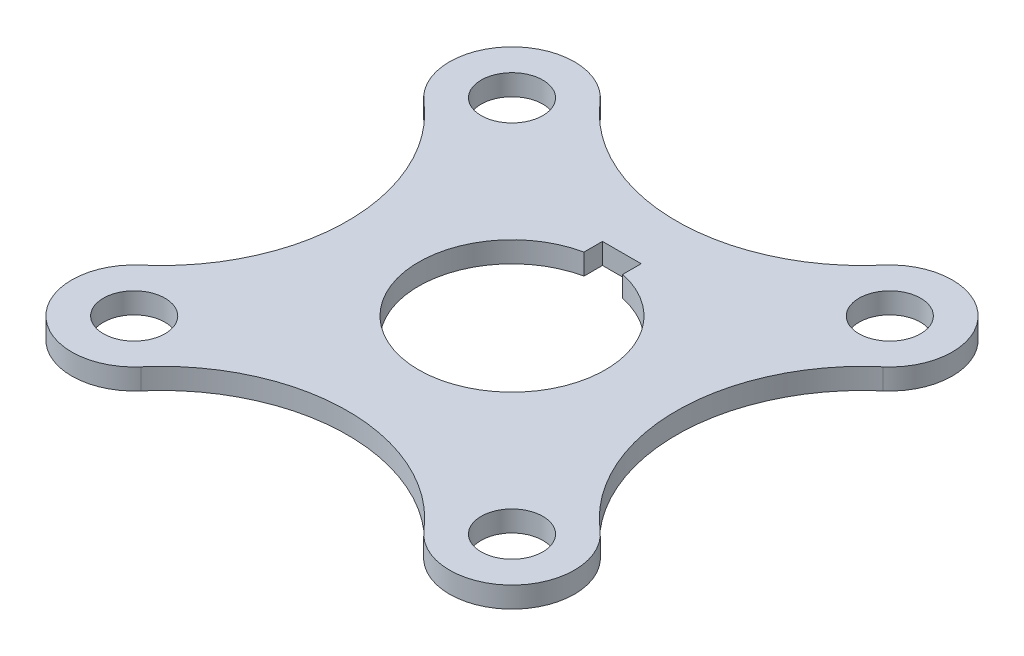
ISO-10303-21;
HEADER;
FILE_DESCRIPTION(('STEP AP214'),'2;1');
FILE_NAME('part.step','',(''),(''),'','','');
FILE_SCHEMA(('AUTOMOTIVE_DESIGN { 1 0 10303 214 1 1 1 1 }'));
ENDSEC;
DATA;
#1=APPLICATION_CONTEXT('core data for automotive mechanical design processes');
#2=APPLICATION_PROTOCOL_DEFINITION('international standard','automotive_design',2000,#1);
#3=PRODUCT_CONTEXT('',#1,'mechanical');
#4=PRODUCT('Part','Part','',(#3));
#5=PRODUCT_RELATED_PRODUCT_CATEGORY('part','',(#4));
#6=PRODUCT_DEFINITION_FORMATION('','',#4);
#7=PRODUCT_DEFINITION_CONTEXT('part definition',#1,'design');
#8=PRODUCT_DEFINITION('design','',#6,#7);
#9=PRODUCT_DEFINITION_SHAPE('','',#8);
#10=(LENGTH_UNIT() NAMED_UNIT(*) SI_UNIT(.MILLI.,.METRE.));
#11=(NAMED_UNIT(*) PLANE_ANGLE_UNIT() SI_UNIT($,.RADIAN.));
#12=(NAMED_UNIT(*) SI_UNIT($,.STERADIAN.) SOLID_ANGLE_UNIT());
#13=UNCERTAINTY_MEASURE_WITH_UNIT(LENGTH_MEASURE(1.E-05),#10,'distance_accuracy_value','');
#14=(GEOMETRIC_REPRESENTATION_CONTEXT(3) GLOBAL_UNCERTAINTY_ASSIGNED_CONTEXT((#13)) GLOBAL_UNIT_ASSIGNED_CONTEXT((#10,
#11,#12)) REPRESENTATION_CONTEXT('',''));
#15=CARTESIAN_POINT('',(0.,0.,0.));
#16=DIRECTION('',(0.,0.,1.));
#17=DIRECTION('',(1.,0.,0.));
#18=AXIS2_PLACEMENT_3D('',#15,#16,#17);
#19=CARTESIAN_POINT('',(-32.813907500035,2.54,-11.4904851942816));
#20=DIRECTION('',(0.,1.,0.));
#21=DIRECTION('',(0.,0.,1.));
#22=AXIS2_PLACEMENT_3D('',#19,#20,#21);
#23=PLANE('',#22);
#24=CARTESIAN_POINT('',(-22.980970388563,2.54,22.9809703885626));
#25=DIRECTION('',(0.,1.,0.));
#26=DIRECTION('',(0.,0.,1.));
#27=AXIS2_PLACEMENT_3D('',#24,#25,#26);
#28=CIRCLE('',#27,3.74999999999979);
#29=CARTESIAN_POINT('',(-22.980970388563,2.54,26.7309703885624));
#30=VERTEX_POINT('',#29);
#31=EDGE_CURVE('E383',#30,#30,#28,.T.);
#32=ORIENTED_EDGE('',*,*,#31,.F.);
#33=EDGE_LOOP('',(#32));
#34=FACE_BOUND('',#33,.T.);
#35=CARTESIAN_POINT('',(22.9809703885627,2.54,22.9809703885629));
#36=DIRECTION('',(0.,1.,0.));
#37=DIRECTION('',(0.,0.,1.));
#38=AXIS2_PLACEMENT_3D('',#35,#36,#37);
#39=CIRCLE('',#38,3.7499999999996);
#40=CARTESIAN_POINT('',(22.9809703885627,2.54,26.7309703885625));
#41=VERTEX_POINT('',#40);
#42=EDGE_CURVE('E373',#41,#41,#39,.T.);
#43=ORIENTED_EDGE('',*,*,#42,.F.);
#44=EDGE_LOOP('',(#43));
#45=FACE_BOUND('',#44,.T.);
#46=CARTESIAN_POINT('',(22.9809703885628,2.54,-22.9809703885628));
#47=DIRECTION('',(0.,1.,0.));
#48=DIRECTION('',(0.,0.,1.));
#49=AXIS2_PLACEMENT_3D('',#46,#47,#48);
#50=CIRCLE('',#49,3.75000000000021);
#51=CARTESIAN_POINT('',(22.9809703885628,2.54,-19.2309703885625));
#52=VERTEX_POINT('',#51);
#53=EDGE_CURVE('E363',#52,#52,#50,.T.);
#54=ORIENTED_EDGE('',*,*,#53,.F.);
#55=EDGE_LOOP('',(#54));
#56=FACE_BOUND('',#55,.T.);
#57=CARTESIAN_POINT('',(-22.9809703885625,2.54,-22.9809703885631));
#58=DIRECTION('',(0.,1.,0.));
#59=DIRECTION('',(0.,0.,1.));
#60=AXIS2_PLACEMENT_3D('',#57,#58,#59);
#61=CIRCLE('',#60,3.75);
#62=CARTESIAN_POINT('',(-22.9809703885625,2.54,-19.2309703885631));
#63=VERTEX_POINT('',#62);
#64=EDGE_CURVE('E370',#63,#63,#61,.T.);
#65=ORIENTED_EDGE('',*,*,#64,.F.);
#66=EDGE_LOOP('',(#65));
#67=FACE_BOUND('',#66,.T.);
#68=CARTESIAN_POINT('',(-42.6468446115075,2.54,0.));
#69=DIRECTION('',(0.,-1.,0.));
#70=DIRECTION('',(0.,0.,1.));
#71=AXIS2_PLACEMENT_3D('',#68,#69,#70);
#72=CIRCLE('',#71,22.6468446115076);
#73=CARTESIAN_POINT('',(-27.922333562608,2.54,-17.2066366623063));
#74=VERTEX_POINT('',#73);
#75=CARTESIAN_POINT('',(-27.9223335626085,2.54,17.2066366623057));
#76=VERTEX_POINT('',#75);
#77=EDGE_CURVE('E187',#74,#76,#72,.T.);
#78=ORIENTED_EDGE('',*,*,#77,.T.);
#79=CARTESIAN_POINT('',(-22.980970388563,2.54,22.9809703885626));
#80=DIRECTION('',(0.,1.,0.));
#81=DIRECTION('',(0.,0.,1.));
#82=AXIS2_PLACEMENT_3D('',#79,#80,#81);
#83=CIRCLE('',#82,7.6);
#84=CARTESIAN_POINT('',(-17.2066366623062,2.54,27.9223335626081));
#85=VERTEX_POINT('',#84);
#86=EDGE_CURVE('E191',#76,#85,#83,.T.);
#87=ORIENTED_EDGE('',*,*,#86,.T.);
#88=CARTESIAN_POINT('',(0.,2.54,42.6468446115075));
#89=DIRECTION('',(0.,-1.,0.));
#90=DIRECTION('',(0.,0.,1.));
#91=AXIS2_PLACEMENT_3D('',#88,#89,#90);
#92=CIRCLE('',#91,22.6468446115075);
#93=CARTESIAN_POINT('',(17.2066366623059,2.54,27.9223335626083));
#94=VERTEX_POINT('',#93);
#95=EDGE_CURVE('E195',#85,#94,#92,.T.);
#96=ORIENTED_EDGE('',*,*,#95,.T.);
#97=CARTESIAN_POINT('',(22.9809703885627,2.54,22.9809703885629));
#98=DIRECTION('',(0.,1.,0.));
#99=DIRECTION('',(0.,0.,1.));
#100=AXIS2_PLACEMENT_3D('',#97,#98,#99);
#101=CIRCLE('',#100,7.6);
#102=CARTESIAN_POINT('',(27.9223335626082,2.54,17.2066366623061));
#103=VERTEX_POINT('',#102);
#104=EDGE_CURVE('E198',#94,#103,#101,.T.);
#105=ORIENTED_EDGE('',*,*,#104,.T.);
#106=CARTESIAN_POINT('',(42.6468446115075,2.54,0.));
#107=DIRECTION('',(0.,-1.,0.));
#108=DIRECTION('',(0.,0.,1.));
#109=AXIS2_PLACEMENT_3D('',#106,#107,#108);
#110=CIRCLE('',#109,22.6468446115075);
#111=CARTESIAN_POINT('',(27.9223335626083,2.54,-17.2066366623059));
#112=VERTEX_POINT('',#111);
#113=EDGE_CURVE('E201',#103,#112,#110,.T.);
#114=ORIENTED_EDGE('',*,*,#113,.T.);
#115=CARTESIAN_POINT('',(22.9809703885628,2.54,-22.9809703885627));
#116=DIRECTION('',(0.,1.,0.));
#117=DIRECTION('',(0.,0.,1.));
#118=AXIS2_PLACEMENT_3D('',#115,#116,#117);
#119=CIRCLE('',#118,7.60000000000001);
#120=CARTESIAN_POINT('',(17.206636662306,2.54,-27.9223335626083));
#121=VERTEX_POINT('',#120);
#122=EDGE_CURVE('E204',#112,#121,#119,.T.);
#123=ORIENTED_EDGE('',*,*,#122,.T.);
#124=CARTESIAN_POINT('',(0.,2.54,-42.6468446115075));
#125=DIRECTION('',(0.,-1.,0.));
#126=DIRECTION('',(0.,0.,1.));
#127=AXIS2_PLACEMENT_3D('',#124,#125,#126);
#128=CIRCLE('',#127,22.6468446115075);
#129=CARTESIAN_POINT('',(-17.2066366623059,2.54,-27.9223335626084));
#130=VERTEX_POINT('',#129);
#131=EDGE_CURVE('E207',#121,#130,#128,.T.);
#132=ORIENTED_EDGE('',*,*,#131,.T.);
#133=CARTESIAN_POINT('',(-22.9809703885625,2.54,-22.9809703885631));
#134=DIRECTION('',(0.,1.,0.));
#135=DIRECTION('',(0.,0.,1.));
#136=AXIS2_PLACEMENT_3D('',#133,#134,#135);
#137=CIRCLE('',#136,7.60000000000001);
#138=EDGE_CURVE('E210',#130,#74,#137,.T.);
#139=ORIENTED_EDGE('',*,*,#138,.T.);
#140=EDGE_LOOP('',(#78,#87,#96,#105,#114,#123,#132,#139));
#141=FACE_BOUND('',#140,.T.);
#142=CARTESIAN_POINT('',(0.,2.54,0.));
#143=DIRECTION('',(0.,1.,0.));
#144=DIRECTION('',(0.,0.,1.));
#145=AXIS2_PLACEMENT_3D('',#142,#143,#144);
#146=CIRCLE('',#145,11.3594444444444);
#147=CARTESIAN_POINT('',(-2.35326156738769,2.54,-11.113016605849));
#148=VERTEX_POINT('',#147);
#149=CARTESIAN_POINT('',(2.3532615673877,2.54,-11.113016605849));
#150=VERTEX_POINT('',#149);
#151=EDGE_CURVE('E146',#148,#150,#146,.T.);
#152=ORIENTED_EDGE('',*,*,#151,.F.);
#153=DIRECTION('',(0.,0.,1.));
#154=VECTOR('',#153,1.);
#155=CARTESIAN_POINT('',(-2.3532615673877,2.54,-13.3594444444444));
#156=LINE('',#155,#154);
#157=CARTESIAN_POINT('',(-2.3532615673877,2.54,-13.3594444444444));
#158=VERTEX_POINT('',#157);
#159=EDGE_CURVE('E137',#158,#148,#156,.T.);
#160=ORIENTED_EDGE('',*,*,#159,.F.);
#161=DIRECTION('',(-1.,0.,0.));
#162=VECTOR('',#161,1.);
#163=CARTESIAN_POINT('',(2.3532615673877,2.54,-13.3594444444444));
#164=LINE('',#163,#162);
#165=CARTESIAN_POINT('',(2.35326156738769,2.54,-13.3594444444444));
#166=VERTEX_POINT('',#165);
#167=EDGE_CURVE('E163',#166,#158,#164,.T.);
#168=ORIENTED_EDGE('',*,*,#167,.F.);
#169=DIRECTION('',(0.,0.,-1.));
#170=VECTOR('',#169,1.);
#171=CARTESIAN_POINT('',(2.3532615673877,2.54,-13.3594444444444));
#172=LINE('',#171,#170);
#173=EDGE_CURVE('E159',#150,#166,#172,.T.);
#174=ORIENTED_EDGE('',*,*,#173,.F.);
#175=EDGE_LOOP('',(#152,#160,#168,#174));
#176=FACE_BOUND('',#175,.T.);
#177=ADVANCED_FACE('F47',(#34,#45,#56,#67,#141,#176),#23,.T.);
#178=CARTESIAN_POINT('',(-32.813907500035,0.,-11.4904851942816));
#179=DIRECTION('',(0.,1.,0.));
#180=DIRECTION('',(0.,0.,1.));
#181=AXIS2_PLACEMENT_3D('',#178,#179,#180);
#182=PLANE('',#181);
#183=CARTESIAN_POINT('',(-22.980970388563,0.,22.9809703885626));
#184=DIRECTION('',(0.,1.,0.));
#185=DIRECTION('',(0.,0.,1.));
#186=AXIS2_PLACEMENT_3D('',#183,#184,#185);
#187=CIRCLE('',#186,3.74999999999979);
#188=CARTESIAN_POINT('',(-22.980970388563,0.,26.7309703885624));
#189=VERTEX_POINT('',#188);
#190=EDGE_CURVE('E379',#189,#189,#187,.T.);
#191=ORIENTED_EDGE('',*,*,#190,.T.);
#192=EDGE_LOOP('',(#191));
#193=FACE_BOUND('',#192,.T.);
#194=CARTESIAN_POINT('',(22.9809703885627,0.,22.9809703885629));
#195=DIRECTION('',(0.,1.,0.));
#196=DIRECTION('',(0.,0.,1.));
#197=AXIS2_PLACEMENT_3D('',#194,#195,#196);
#198=CIRCLE('',#197,3.7499999999996);
#199=CARTESIAN_POINT('',(22.9809703885627,0.,26.7309703885625));
#200=VERTEX_POINT('',#199);
#201=EDGE_CURVE('E366',#200,#200,#198,.T.);
#202=ORIENTED_EDGE('',*,*,#201,.T.);
#203=EDGE_LOOP('',(#202));
#204=FACE_BOUND('',#203,.T.);
#205=CARTESIAN_POINT('',(22.9809703885628,0.,-22.9809703885628));
#206=DIRECTION('',(0.,1.,0.));
#207=DIRECTION('',(0.,0.,1.));
#208=AXIS2_PLACEMENT_3D('',#205,#206,#207);
#209=CIRCLE('',#208,3.75000000000021);
#210=CARTESIAN_POINT('',(22.9809703885628,0.,-19.2309703885625));
#211=VERTEX_POINT('',#210);
#212=EDGE_CURVE('E360',#211,#211,#209,.T.);
#213=ORIENTED_EDGE('',*,*,#212,.T.);
#214=EDGE_LOOP('',(#213));
#215=FACE_BOUND('',#214,.T.);
#216=CARTESIAN_POINT('',(-22.9809703885625,0.,-22.9809703885631));
#217=DIRECTION('',(0.,1.,0.));
#218=DIRECTION('',(0.,0.,1.));
#219=AXIS2_PLACEMENT_3D('',#216,#217,#218);
#220=CIRCLE('',#219,3.75);
#221=CARTESIAN_POINT('',(-22.9809703885625,0.,-19.2309703885631));
#222=VERTEX_POINT('',#221);
#223=EDGE_CURVE('E171',#222,#222,#220,.T.);
#224=ORIENTED_EDGE('',*,*,#223,.T.);
#225=EDGE_LOOP('',(#224));
#226=FACE_BOUND('',#225,.T.);
#227=CARTESIAN_POINT('',(-42.6468446115075,0.,0.));
#228=DIRECTION('',(0.,-1.,0.));
#229=DIRECTION('',(0.,0.,1.));
#230=AXIS2_PLACEMENT_3D('',#227,#228,#229);
#231=CIRCLE('',#230,22.6468446115076);
#232=CARTESIAN_POINT('',(-27.922333562608,0.,-17.2066366623063));
#233=VERTEX_POINT('',#232);
#234=CARTESIAN_POINT('',(-27.9223335626085,0.,17.2066366623057));
#235=VERTEX_POINT('',#234);
#236=EDGE_CURVE('E155',#233,#235,#231,.T.);
#237=ORIENTED_EDGE('',*,*,#236,.F.);
#238=CARTESIAN_POINT('',(-22.9809703885625,0.,-22.9809703885631));
#239=DIRECTION('',(0.,1.,0.));
#240=DIRECTION('',(0.,0.,1.));
#241=AXIS2_PLACEMENT_3D('',#238,#239,#240);
#242=CIRCLE('',#241,7.60000000000001);
#243=CARTESIAN_POINT('',(-17.2066366623059,0.,-27.9223335626084));
#244=VERTEX_POINT('',#243);
#245=EDGE_CURVE('E192',#244,#233,#242,.T.);
#246=ORIENTED_EDGE('',*,*,#245,.F.);
#247=CARTESIAN_POINT('',(0.,0.,-42.6468446115075));
#248=DIRECTION('',(0.,-1.,0.));
#249=DIRECTION('',(0.,0.,1.));
#250=AXIS2_PLACEMENT_3D('',#247,#248,#249);
#251=CIRCLE('',#250,22.6468446115075);
#252=CARTESIAN_POINT('',(17.206636662306,0.,-27.9223335626083));
#253=VERTEX_POINT('',#252);
#254=EDGE_CURVE('E232',#253,#244,#251,.T.);
#255=ORIENTED_EDGE('',*,*,#254,.F.);
#256=CARTESIAN_POINT('',(22.9809703885628,0.,-22.9809703885627));
#257=DIRECTION('',(0.,1.,0.));
#258=DIRECTION('',(0.,0.,1.));
#259=AXIS2_PLACEMENT_3D('',#256,#257,#258);
#260=CIRCLE('',#259,7.60000000000001);
#261=CARTESIAN_POINT('',(27.9223335626083,0.,-17.2066366623059));
#262=VERTEX_POINT('',#261);
#263=EDGE_CURVE('E229',#262,#253,#260,.T.);
#264=ORIENTED_EDGE('',*,*,#263,.F.);
#265=CARTESIAN_POINT('',(42.6468446115075,0.,0.));
#266=DIRECTION('',(0.,-1.,0.));
#267=DIRECTION('',(0.,0.,1.));
#268=AXIS2_PLACEMENT_3D('',#265,#266,#267);
#269=CIRCLE('',#268,22.6468446115075);
#270=CARTESIAN_POINT('',(27.9223335626082,0.,17.2066366623061));
#271=VERTEX_POINT('',#270);
#272=EDGE_CURVE('E226',#271,#262,#269,.T.);
#273=ORIENTED_EDGE('',*,*,#272,.F.);
#274=CARTESIAN_POINT('',(22.9809703885627,0.,22.9809703885629));
#275=DIRECTION('',(0.,1.,0.));
#276=DIRECTION('',(0.,0.,1.));
#277=AXIS2_PLACEMENT_3D('',#274,#275,#276);
#278=CIRCLE('',#277,7.6);
#279=CARTESIAN_POINT('',(17.2066366623059,0.,27.9223335626083));
#280=VERTEX_POINT('',#279);
#281=EDGE_CURVE('E223',#280,#271,#278,.T.);
#282=ORIENTED_EDGE('',*,*,#281,.F.);
#283=CARTESIAN_POINT('',(0.,0.,42.6468446115075));
#284=DIRECTION('',(0.,-1.,0.));
#285=DIRECTION('',(0.,0.,1.));
#286=AXIS2_PLACEMENT_3D('',#283,#284,#285);
#287=CIRCLE('',#286,22.6468446115075);
#288=CARTESIAN_POINT('',(-17.2066366623062,0.,27.9223335626081));
#289=VERTEX_POINT('',#288);
#290=EDGE_CURVE('E220',#289,#280,#287,.T.);
#291=ORIENTED_EDGE('',*,*,#290,.F.);
#292=CARTESIAN_POINT('',(-22.980970388563,0.,22.9809703885626));
#293=DIRECTION('',(0.,1.,0.));
#294=DIRECTION('',(0.,0.,1.));
#295=AXIS2_PLACEMENT_3D('',#292,#293,#294);
#296=CIRCLE('',#295,7.6);
#297=EDGE_CURVE('E217',#235,#289,#296,.T.);
#298=ORIENTED_EDGE('',*,*,#297,.F.);
#299=EDGE_LOOP('',(#237,#246,#255,#264,#273,#282,#291,#298));
#300=FACE_BOUND('',#299,.T.);
#301=DIRECTION('',(0.,0.,1.));
#302=VECTOR('',#301,1.);
#303=CARTESIAN_POINT('',(-2.3532615673877,0.,-13.3594444444444));
#304=LINE('',#303,#302);
#305=CARTESIAN_POINT('',(-2.3532615673877,0.,-13.3594444444444));
#306=VERTEX_POINT('',#305);
#307=CARTESIAN_POINT('',(-2.35326156738769,0.,-11.113016605849));
#308=VERTEX_POINT('',#307);
#309=EDGE_CURVE('E71',#306,#308,#304,.T.);
#310=ORIENTED_EDGE('',*,*,#309,.T.);
#311=CARTESIAN_POINT('',(0.,0.,0.));
#312=DIRECTION('',(0.,1.,0.));
#313=DIRECTION('',(0.,0.,1.));
#314=AXIS2_PLACEMENT_3D('',#311,#312,#313);
#315=CIRCLE('',#314,11.3594444444444);
#316=CARTESIAN_POINT('',(2.3532615673877,0.,-11.113016605849));
#317=VERTEX_POINT('',#316);
#318=EDGE_CURVE('E153',#308,#317,#315,.T.);
#319=ORIENTED_EDGE('',*,*,#318,.T.);
#320=DIRECTION('',(0.,0.,-1.));
#321=VECTOR('',#320,1.);
#322=CARTESIAN_POINT('',(2.3532615673877,0.,-13.3594444444444));
#323=LINE('',#322,#321);
#324=CARTESIAN_POINT('',(2.3532615673877,0.,-13.3594444444444));
#325=VERTEX_POINT('',#324);
#326=EDGE_CURVE('E174',#317,#325,#323,.T.);
#327=ORIENTED_EDGE('',*,*,#326,.T.);
#328=DIRECTION('',(-1.,0.,0.));
#329=VECTOR('',#328,1.);
#330=CARTESIAN_POINT('',(2.3532615673877,0.,-13.3594444444444));
#331=LINE('',#330,#329);
#332=EDGE_CURVE('E147',#325,#306,#331,.T.);
#333=ORIENTED_EDGE('',*,*,#332,.T.);
#334=EDGE_LOOP('',(#310,#319,#327,#333));
#335=FACE_BOUND('',#334,.T.);
#336=ADVANCED_FACE('F271',(#193,#204,#215,#226,#300,#335),#182,.F.);
#337=CARTESIAN_POINT('',(-42.6468446115075,2.54,0.));
#338=DIRECTION('',(0.,-1.,0.));
#339=DIRECTION('',(0.,0.,-1.));
#340=AXIS2_PLACEMENT_3D('',#337,#338,#339);
#341=CYLINDRICAL_SURFACE('',#340,22.6468446115076);
#342=ORIENTED_EDGE('',*,*,#236,.T.);
#343=DIRECTION('',(0.,-1.,0.));
#344=VECTOR('',#343,1.);
#345=CARTESIAN_POINT('',(-27.9223335626085,2.54,17.2066366623057));
#346=LINE('',#345,#344);
#347=EDGE_CURVE('E11',#76,#235,#346,.T.);
#348=ORIENTED_EDGE('',*,*,#347,.F.);
#349=ORIENTED_EDGE('',*,*,#77,.F.);
#350=DIRECTION('',(0.,-1.,0.));
#351=VECTOR('',#350,1.);
#352=CARTESIAN_POINT('',(-27.922333562608,2.54,-17.2066366623063));
#353=LINE('',#352,#351);
#354=EDGE_CURVE('E213',#74,#233,#353,.T.);
#355=ORIENTED_EDGE('',*,*,#354,.T.);
#356=EDGE_LOOP('',(#342,#348,#349,#355));
#357=FACE_BOUND('',#356,.T.);
#358=ADVANCED_FACE('F49',(#357),#341,.F.);
#359=CARTESIAN_POINT('',(-22.980970388563,2.54,22.9809703885626));
#360=DIRECTION('',(0.,-1.,0.));
#361=DIRECTION('',(0.,0.,-1.));
#362=AXIS2_PLACEMENT_3D('',#359,#360,#361);
#363=CYLINDRICAL_SURFACE('',#362,7.6);
#364=ORIENTED_EDGE('',*,*,#297,.T.);
#365=DIRECTION('',(0.,-1.,0.));
#366=VECTOR('',#365,1.);
#367=CARTESIAN_POINT('',(-17.2066366623062,2.54,27.9223335626081));
#368=LINE('',#367,#366);
#369=EDGE_CURVE('E56',#85,#289,#368,.T.);
#370=ORIENTED_EDGE('',*,*,#369,.F.);
#371=ORIENTED_EDGE('',*,*,#86,.F.);
#372=ORIENTED_EDGE('',*,*,#347,.T.);
#373=EDGE_LOOP('',(#364,#370,#371,#372));
#374=FACE_BOUND('',#373,.T.);
#375=ADVANCED_FACE('F288',(#374),#363,.T.);
#376=CARTESIAN_POINT('',(0.,2.54,42.6468446115075));
#377=DIRECTION('',(0.,-1.,0.));
#378=DIRECTION('',(0.,0.,-1.));
#379=AXIS2_PLACEMENT_3D('',#376,#377,#378);
#380=CYLINDRICAL_SURFACE('',#379,22.6468446115075);
#381=ORIENTED_EDGE('',*,*,#290,.T.);
#382=DIRECTION('',(0.,-1.,0.));
#383=VECTOR('',#382,1.);
#384=CARTESIAN_POINT('',(17.2066366623059,2.54,27.9223335626083));
#385=LINE('',#384,#383);
#386=EDGE_CURVE('E256',#94,#280,#385,.T.);
#387=ORIENTED_EDGE('',*,*,#386,.F.);
#388=ORIENTED_EDGE('',*,*,#95,.F.);
#389=ORIENTED_EDGE('',*,*,#369,.T.);
#390=EDGE_LOOP('',(#381,#387,#388,#389));
#391=FACE_BOUND('',#390,.T.);
#392=ADVANCED_FACE('F265',(#391),#380,.F.);
#393=CARTESIAN_POINT('',(22.9809703885627,2.54,22.9809703885629));
#394=DIRECTION('',(0.,-1.,0.));
#395=DIRECTION('',(0.,0.,-1.));
#396=AXIS2_PLACEMENT_3D('',#393,#394,#395);
#397=CYLINDRICAL_SURFACE('',#396,7.6);
#398=ORIENTED_EDGE('',*,*,#281,.T.);
#399=DIRECTION('',(0.,-1.,0.));
#400=VECTOR('',#399,1.);
#401=CARTESIAN_POINT('',(27.9223335626082,2.54,17.2066366623061));
#402=LINE('',#401,#400);
#403=EDGE_CURVE('E252',#103,#271,#402,.T.);
#404=ORIENTED_EDGE('',*,*,#403,.F.);
#405=ORIENTED_EDGE('',*,*,#104,.F.);
#406=ORIENTED_EDGE('',*,*,#386,.T.);
#407=EDGE_LOOP('',(#398,#404,#405,#406));
#408=FACE_BOUND('',#407,.T.);
#409=ADVANCED_FACE('F277',(#408),#397,.T.);
#410=CARTESIAN_POINT('',(42.6468446115075,2.54,0.));
#411=DIRECTION('',(0.,-1.,0.));
#412=DIRECTION('',(0.,0.,-1.));
#413=AXIS2_PLACEMENT_3D('',#410,#411,#412);
#414=CYLINDRICAL_SURFACE('',#413,22.6468446115075);
#415=ORIENTED_EDGE('',*,*,#272,.T.);
#416=DIRECTION('',(0.,-1.,0.));
#417=VECTOR('',#416,1.);
#418=CARTESIAN_POINT('',(27.9223335626083,2.54,-17.2066366623059));
#419=LINE('',#418,#417);
#420=EDGE_CURVE('E248',#112,#262,#419,.T.);
#421=ORIENTED_EDGE('',*,*,#420,.F.);
#422=ORIENTED_EDGE('',*,*,#113,.F.);
#423=ORIENTED_EDGE('',*,*,#403,.T.);
#424=EDGE_LOOP('',(#415,#421,#422,#423));
#425=FACE_BOUND('',#424,.T.);
#426=ADVANCED_FACE('F281',(#425),#414,.F.);
#427=CARTESIAN_POINT('',(22.9809703885628,2.54,-22.9809703885627));
#428=DIRECTION('',(0.,-1.,0.));
#429=DIRECTION('',(0.,0.,-1.));
#430=AXIS2_PLACEMENT_3D('',#427,#428,#429);
#431=CYLINDRICAL_SURFACE('',#430,7.60000000000001);
#432=ORIENTED_EDGE('',*,*,#263,.T.);
#433=DIRECTION('',(0.,-1.,0.));
#434=VECTOR('',#433,1.);
#435=CARTESIAN_POINT('',(17.206636662306,2.54,-27.9223335626083));
#436=LINE('',#435,#434);
#437=EDGE_CURVE('E244',#121,#253,#436,.T.);
#438=ORIENTED_EDGE('',*,*,#437,.F.);
#439=ORIENTED_EDGE('',*,*,#122,.F.);
#440=ORIENTED_EDGE('',*,*,#420,.T.);
#441=EDGE_LOOP('',(#432,#438,#439,#440));
#442=FACE_BOUND('',#441,.T.);
#443=ADVANCED_FACE('F301',(#442),#431,.T.);
#444=CARTESIAN_POINT('',(0.,2.54,-42.6468446115075));
#445=DIRECTION('',(0.,-1.,0.));
#446=DIRECTION('',(0.,0.,-1.));
#447=AXIS2_PLACEMENT_3D('',#444,#445,#446);
#448=CYLINDRICAL_SURFACE('',#447,22.6468446115075);
#449=ORIENTED_EDGE('',*,*,#254,.T.);
#450=DIRECTION('',(0.,-1.,0.));
#451=VECTOR('',#450,1.);
#452=CARTESIAN_POINT('',(-17.2066366623059,2.54,-27.9223335626084));
#453=LINE('',#452,#451);
#454=EDGE_CURVE('E240',#130,#244,#453,.T.);
#455=ORIENTED_EDGE('',*,*,#454,.F.);
#456=ORIENTED_EDGE('',*,*,#131,.F.);
#457=ORIENTED_EDGE('',*,*,#437,.T.);
#458=EDGE_LOOP('',(#449,#455,#456,#457));
#459=FACE_BOUND('',#458,.T.);
#460=ADVANCED_FACE('F299',(#459),#448,.F.);
#461=CARTESIAN_POINT('',(-22.9809703885625,2.54,-22.9809703885631));
#462=DIRECTION('',(0.,-1.,0.));
#463=DIRECTION('',(0.,0.,-1.));
#464=AXIS2_PLACEMENT_3D('',#461,#462,#463);
#465=CYLINDRICAL_SURFACE('',#464,7.60000000000001);
#466=ORIENTED_EDGE('',*,*,#245,.T.);
#467=ORIENTED_EDGE('',*,*,#354,.F.);
#468=ORIENTED_EDGE('',*,*,#138,.F.);
#469=ORIENTED_EDGE('',*,*,#454,.T.);
#470=EDGE_LOOP('',(#466,#467,#468,#469));
#471=FACE_BOUND('',#470,.T.);
#472=ADVANCED_FACE('F294',(#471),#465,.T.);
#473=CARTESIAN_POINT('',(-2.3532615673877,2.54,-13.3594444444444));
#474=DIRECTION('',(1.,0.,0.));
#475=DIRECTION('',(0.,0.,-1.));
#476=AXIS2_PLACEMENT_3D('',#473,#474,#475);
#477=PLANE('',#476);
#478=ORIENTED_EDGE('',*,*,#309,.F.);
#479=DIRECTION('',(0.,-1.,0.));
#480=VECTOR('',#479,1.);
#481=CARTESIAN_POINT('',(-2.3532615673877,2.54,-13.3594444444444));
#482=LINE('',#481,#480);
#483=EDGE_CURVE('E141',#158,#306,#482,.T.);
#484=ORIENTED_EDGE('',*,*,#483,.F.);
#485=ORIENTED_EDGE('',*,*,#159,.T.);
#486=DIRECTION('',(0.,-1.,0.));
#487=VECTOR('',#486,1.);
#488=CARTESIAN_POINT('',(-2.35326156738769,2.54,-11.113016605849));
#489=LINE('',#488,#487);
#490=EDGE_CURVE('E140',#148,#308,#489,.T.);
#491=ORIENTED_EDGE('',*,*,#490,.T.);
#492=EDGE_LOOP('',(#478,#484,#485,#491));
#493=FACE_BOUND('',#492,.T.);
#494=ADVANCED_FACE('F139',(#493),#477,.T.);
#495=CARTESIAN_POINT('',(0.,2.54,0.));
#496=DIRECTION('',(0.,-1.,0.));
#497=DIRECTION('',(0.,0.,-1.));
#498=AXIS2_PLACEMENT_3D('',#495,#496,#497);
#499=CYLINDRICAL_SURFACE('',#498,11.3594444444444);
#500=ORIENTED_EDGE('',*,*,#318,.F.);
#501=ORIENTED_EDGE('',*,*,#490,.F.);
#502=ORIENTED_EDGE('',*,*,#151,.T.);
#503=DIRECTION('',(0.,-1.,0.));
#504=VECTOR('',#503,1.);
#505=CARTESIAN_POINT('',(2.3532615673877,2.54,-11.113016605849));
#506=LINE('',#505,#504);
#507=EDGE_CURVE('E156',#150,#317,#506,.T.);
#508=ORIENTED_EDGE('',*,*,#507,.T.);
#509=EDGE_LOOP('',(#500,#501,#502,#508));
#510=FACE_BOUND('',#509,.T.);
#511=ADVANCED_FACE('F150',(#510),#499,.F.);
#512=CARTESIAN_POINT('',(2.3532615673877,2.54,-13.3594444444444));
#513=DIRECTION('',(-1.,0.,0.));
#514=DIRECTION('',(0.,0.,1.));
#515=AXIS2_PLACEMENT_3D('',#512,#513,#514);
#516=PLANE('',#515);
#517=ORIENTED_EDGE('',*,*,#326,.F.);
#518=ORIENTED_EDGE('',*,*,#507,.F.);
#519=ORIENTED_EDGE('',*,*,#173,.T.);
#520=DIRECTION('',(0.,-1.,0.));
#521=VECTOR('',#520,1.);
#522=CARTESIAN_POINT('',(2.3532615673877,2.54,-13.3594444444444));
#523=LINE('',#522,#521);
#524=EDGE_CURVE('E63',#166,#325,#523,.T.);
#525=ORIENTED_EDGE('',*,*,#524,.T.);
#526=EDGE_LOOP('',(#517,#518,#519,#525));
#527=FACE_BOUND('',#526,.T.);
#528=ADVANCED_FACE('F331',(#527),#516,.T.);
#529=CARTESIAN_POINT('',(2.3532615673877,2.54,-13.3594444444444));
#530=DIRECTION('',(0.,0.,1.));
#531=DIRECTION('',(1.,0.,0.));
#532=AXIS2_PLACEMENT_3D('',#529,#530,#531);
#533=PLANE('',#532);
#534=ORIENTED_EDGE('',*,*,#332,.F.);
#535=ORIENTED_EDGE('',*,*,#524,.F.);
#536=ORIENTED_EDGE('',*,*,#167,.T.);
#537=ORIENTED_EDGE('',*,*,#483,.T.);
#538=EDGE_LOOP('',(#534,#535,#536,#537));
#539=FACE_BOUND('',#538,.T.);
#540=ADVANCED_FACE('F335',(#539),#533,.T.);
#541=CARTESIAN_POINT('',(-22.9809703885625,0.,-22.9809703885631));
#542=DIRECTION('',(0.,1.,0.));
#543=DIRECTION('',(0.,0.,1.));
#544=AXIS2_PLACEMENT_3D('',#541,#542,#543);
#545=CYLINDRICAL_SURFACE('',#544,3.75);
#546=ORIENTED_EDGE('',*,*,#223,.F.);
#547=EDGE_LOOP('',(#546));
#548=FACE_BOUND('',#547,.T.);
#549=ORIENTED_EDGE('',*,*,#64,.T.);
#550=EDGE_LOOP('',(#549));
#551=FACE_BOUND('',#550,.T.);
#552=ADVANCED_FACE('F340',(#548,#551),#545,.F.);
#553=CARTESIAN_POINT('',(22.9809703885628,0.,-22.9809703885628));
#554=DIRECTION('',(0.,1.,0.));
#555=DIRECTION('',(0.,0.,1.));
#556=AXIS2_PLACEMENT_3D('',#553,#554,#555);
#557=CYLINDRICAL_SURFACE('',#556,3.75000000000021);
#558=ORIENTED_EDGE('',*,*,#212,.F.);
#559=EDGE_LOOP('',(#558));
#560=FACE_BOUND('',#559,.T.);
#561=ORIENTED_EDGE('',*,*,#53,.T.);
#562=EDGE_LOOP('',(#561));
#563=FACE_BOUND('',#562,.T.);
#564=ADVANCED_FACE('F343',(#560,#563),#557,.F.);
#565=CARTESIAN_POINT('',(22.9809703885627,0.,22.9809703885629));
#566=DIRECTION('',(0.,1.,0.));
#567=DIRECTION('',(0.,0.,1.));
#568=AXIS2_PLACEMENT_3D('',#565,#566,#567);
#569=CYLINDRICAL_SURFACE('',#568,3.7499999999996);
#570=ORIENTED_EDGE('',*,*,#201,.F.);
#571=EDGE_LOOP('',(#570));
#572=FACE_BOUND('',#571,.T.);
#573=ORIENTED_EDGE('',*,*,#42,.T.);
#574=EDGE_LOOP('',(#573));
#575=FACE_BOUND('',#574,.T.);
#576=ADVANCED_FACE('F348',(#572,#575),#569,.F.);
#577=CARTESIAN_POINT('',(-22.980970388563,0.,22.9809703885626));
#578=DIRECTION('',(0.,1.,0.));
#579=DIRECTION('',(0.,0.,1.));
#580=AXIS2_PLACEMENT_3D('',#577,#578,#579);
#581=CYLINDRICAL_SURFACE('',#580,3.74999999999979);
#582=ORIENTED_EDGE('',*,*,#190,.F.);
#583=EDGE_LOOP('',(#582));
#584=FACE_BOUND('',#583,.T.);
#585=ORIENTED_EDGE('',*,*,#31,.T.);
#586=EDGE_LOOP('',(#585));
#587=FACE_BOUND('',#586,.T.);
#588=ADVANCED_FACE('F345',(#584,#587),#581,.F.);
#589=CLOSED_SHELL('',(#177,#336,#358,#375,#392,#409,#426,#443,#460,#472,#494,#511,#528,#540,
#552,#564,#576,#588));
#590=MANIFOLD_SOLID_BREP('B2',#589);
#591=ADVANCED_BREP_SHAPE_REPRESENTATION('',(#18,#590),#14);
#592=SHAPE_DEFINITION_REPRESENTATION(#9,#591);
ENDSEC;
END-ISO-10303-21;
